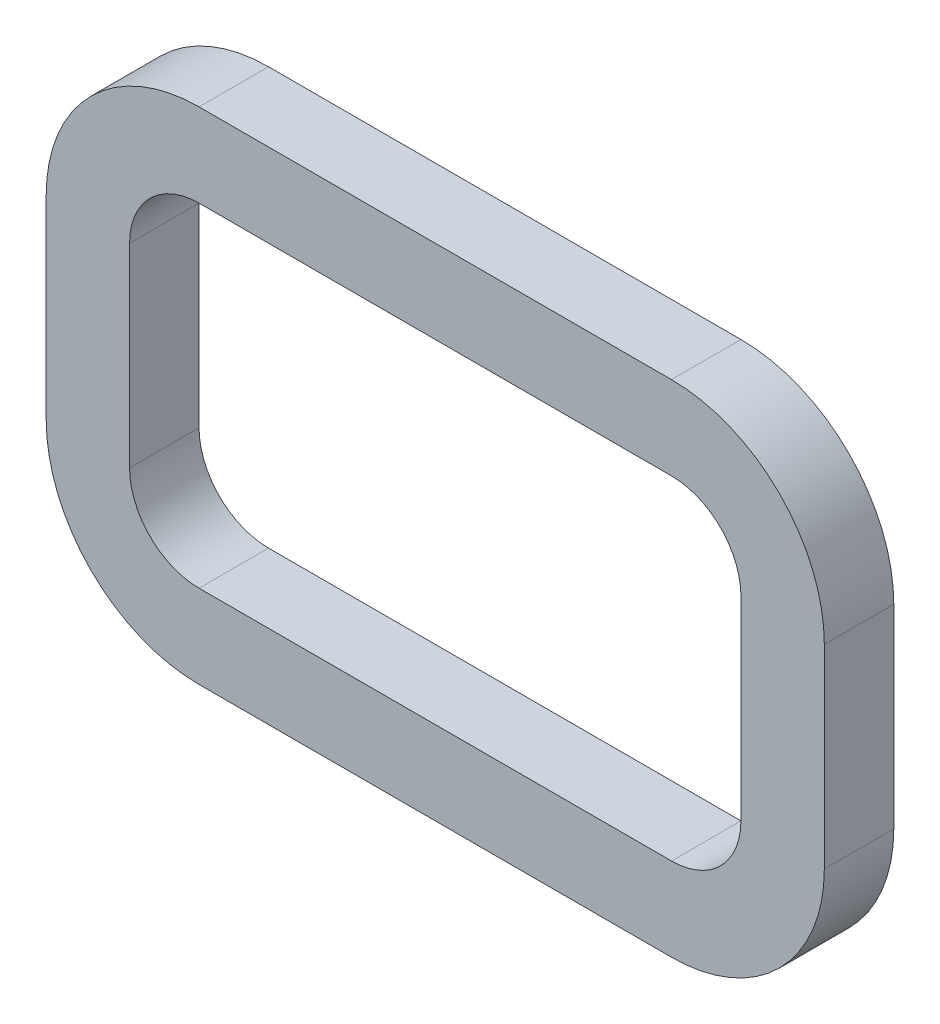
ISO-10303-21;
HEADER;
FILE_DESCRIPTION(('STEP AP214'),'2;1');
FILE_NAME('part.step','',(''),(''),'','','');
FILE_SCHEMA(('AUTOMOTIVE_DESIGN { 1 0 10303 214 1 1 1 1 }'));
ENDSEC;
DATA;
#1=APPLICATION_CONTEXT('core data for automotive mechanical design processes');
#2=APPLICATION_PROTOCOL_DEFINITION('international standard','automotive_design',2000,#1);
#3=PRODUCT_CONTEXT('',#1,'mechanical');
#4=PRODUCT('Part','Part','',(#3));
#5=PRODUCT_RELATED_PRODUCT_CATEGORY('part','',(#4));
#6=PRODUCT_DEFINITION_FORMATION('','',#4);
#7=PRODUCT_DEFINITION_CONTEXT('part definition',#1,'design');
#8=PRODUCT_DEFINITION('design','',#6,#7);
#9=PRODUCT_DEFINITION_SHAPE('','',#8);
#10=(LENGTH_UNIT() NAMED_UNIT(*) SI_UNIT(.MILLI.,.METRE.));
#11=(NAMED_UNIT(*) PLANE_ANGLE_UNIT() SI_UNIT($,.RADIAN.));
#12=(NAMED_UNIT(*) SI_UNIT($,.STERADIAN.) SOLID_ANGLE_UNIT());
#13=UNCERTAINTY_MEASURE_WITH_UNIT(LENGTH_MEASURE(1.E-05),#10,'distance_accuracy_value','');
#14=(GEOMETRIC_REPRESENTATION_CONTEXT(3) GLOBAL_UNCERTAINTY_ASSIGNED_CONTEXT((#13)) GLOBAL_UNIT_ASSIGNED_CONTEXT((#10,
#11,#12)) REPRESENTATION_CONTEXT('',''));
#15=CARTESIAN_POINT('',(0.,0.,0.));
#16=DIRECTION('',(0.,0.,1.));
#17=DIRECTION('',(1.,0.,0.));
#18=AXIS2_PLACEMENT_3D('',#15,#16,#17);
#19=CARTESIAN_POINT('',(170.,70.,50.));
#20=DIRECTION('',(0.,0.,-1.));
#21=DIRECTION('',(-1.,0.,0.));
#22=AXIS2_PLACEMENT_3D('',#19,#20,#21);
#23=PLANE('',#22);
#24=CARTESIAN_POINT('',(170.,70.,50.));
#25=DIRECTION('',(0.,0.,-1.));
#26=DIRECTION('',(-1.,0.,0.));
#27=AXIS2_PLACEMENT_3D('',#24,#25,#26);
#28=CIRCLE('',#27,110.);
#29=CARTESIAN_POINT('',(280.,69.9999999999994,50.));
#30=VERTEX_POINT('',#29);
#31=CARTESIAN_POINT('',(169.999999999999,180.,50.));
#32=VERTEX_POINT('',#31);
#33=EDGE_CURVE('E293',#30,#32,#28,.F.);
#34=ORIENTED_EDGE('',*,*,#33,.T.);
#35=DIRECTION('',(-1.,0.,0.));
#36=VECTOR('',#35,1.);
#37=CARTESIAN_POINT('',(170.,180.,50.));
#38=LINE('',#37,#36);
#39=CARTESIAN_POINT('',(-169.999999999999,180.,50.));
#40=VERTEX_POINT('',#39);
#41=EDGE_CURVE('E297',#32,#40,#38,.T.);
#42=ORIENTED_EDGE('',*,*,#41,.T.);
#43=CARTESIAN_POINT('',(-170.,70.,50.));
#44=DIRECTION('',(0.,0.,-1.));
#45=DIRECTION('',(-1.,0.,0.));
#46=AXIS2_PLACEMENT_3D('',#43,#44,#45);
#47=CIRCLE('',#46,110.);
#48=CARTESIAN_POINT('',(-280.,69.9999999999992,50.));
#49=VERTEX_POINT('',#48);
#50=EDGE_CURVE('E301',#40,#49,#47,.F.);
#51=ORIENTED_EDGE('',*,*,#50,.T.);
#52=DIRECTION('',(0.,-1.,0.));
#53=VECTOR('',#52,1.);
#54=CARTESIAN_POINT('',(-280.,69.9999999999999,50.));
#55=LINE('',#54,#53);
#56=CARTESIAN_POINT('',(-280.,-69.9999999999994,50.));
#57=VERTEX_POINT('',#56);
#58=EDGE_CURVE('E304',#49,#57,#55,.T.);
#59=ORIENTED_EDGE('',*,*,#58,.T.);
#60=CARTESIAN_POINT('',(-170.,-70.,50.));
#61=DIRECTION('',(0.,0.,-1.));
#62=DIRECTION('',(-1.,0.,0.));
#63=AXIS2_PLACEMENT_3D('',#60,#61,#62);
#64=CIRCLE('',#63,110.);
#65=CARTESIAN_POINT('',(-169.999999999999,-180.,50.));
#66=VERTEX_POINT('',#65);
#67=EDGE_CURVE('E307',#57,#66,#64,.F.);
#68=ORIENTED_EDGE('',*,*,#67,.T.);
#69=DIRECTION('',(1.,0.,0.));
#70=VECTOR('',#69,1.);
#71=CARTESIAN_POINT('',(170.,-180.,50.));
#72=LINE('',#71,#70);
#73=CARTESIAN_POINT('',(169.999999999999,-180.,50.));
#74=VERTEX_POINT('',#73);
#75=EDGE_CURVE('E310',#66,#74,#72,.T.);
#76=ORIENTED_EDGE('',*,*,#75,.T.);
#77=CARTESIAN_POINT('',(170.,-70.,50.));
#78=DIRECTION('',(0.,0.,-1.));
#79=DIRECTION('',(-1.,0.,0.));
#80=AXIS2_PLACEMENT_3D('',#77,#78,#79);
#81=CIRCLE('',#80,110.);
#82=CARTESIAN_POINT('',(280.,-70.,50.));
#83=VERTEX_POINT('',#82);
#84=EDGE_CURVE('E313',#74,#83,#81,.F.);
#85=ORIENTED_EDGE('',*,*,#84,.T.);
#86=DIRECTION('',(0.,1.,0.));
#87=VECTOR('',#86,1.);
#88=CARTESIAN_POINT('',(280.,70.,50.));
#89=LINE('',#88,#87);
#90=EDGE_CURVE('E316',#83,#30,#89,.T.);
#91=ORIENTED_EDGE('',*,*,#90,.T.);
#92=EDGE_LOOP('',(#34,#42,#51,#59,#68,#76,#85,#91));
#93=FACE_BOUND('',#92,.T.);
#94=CARTESIAN_POINT('',(170.,70.,50.));
#95=DIRECTION('',(0.,0.,-1.));
#96=DIRECTION('',(-1.,0.,0.));
#97=AXIS2_PLACEMENT_3D('',#94,#95,#96);
#98=CIRCLE('',#97,50.);
#99=CARTESIAN_POINT('',(220.,69.9999999999994,50.));
#100=VERTEX_POINT('',#99);
#101=CARTESIAN_POINT('',(169.999999999999,120.,50.));
#102=VERTEX_POINT('',#101);
#103=EDGE_CURVE('E204',#100,#102,#98,.F.);
#104=ORIENTED_EDGE('',*,*,#103,.F.);
#105=DIRECTION('',(0.,1.,0.));
#106=VECTOR('',#105,1.);
#107=CARTESIAN_POINT('',(220.,70.,50.));
#108=LINE('',#107,#106);
#109=CARTESIAN_POINT('',(220.,-70.,50.));
#110=VERTEX_POINT('',#109);
#111=EDGE_CURVE('E245',#110,#100,#108,.T.);
#112=ORIENTED_EDGE('',*,*,#111,.F.);
#113=CARTESIAN_POINT('',(170.,-70.,50.));
#114=DIRECTION('',(0.,0.,-1.));
#115=DIRECTION('',(-1.,0.,0.));
#116=AXIS2_PLACEMENT_3D('',#113,#114,#115);
#117=CIRCLE('',#116,50.);
#118=CARTESIAN_POINT('',(169.999999999999,-120.,50.));
#119=VERTEX_POINT('',#118);
#120=EDGE_CURVE('E242',#119,#110,#117,.F.);
#121=ORIENTED_EDGE('',*,*,#120,.F.);
#122=DIRECTION('',(1.,0.,0.));
#123=VECTOR('',#122,1.);
#124=CARTESIAN_POINT('',(170.,-120.,50.));
#125=LINE('',#124,#123);
#126=CARTESIAN_POINT('',(-170.,-120.,50.));
#127=VERTEX_POINT('',#126);
#128=EDGE_CURVE('E239',#127,#119,#125,.T.);
#129=ORIENTED_EDGE('',*,*,#128,.F.);
#130=CARTESIAN_POINT('',(-170.,-70.,50.));
#131=DIRECTION('',(0.,0.,-1.));
#132=DIRECTION('',(-1.,0.,0.));
#133=AXIS2_PLACEMENT_3D('',#130,#131,#132);
#134=CIRCLE('',#133,50.);
#135=CARTESIAN_POINT('',(-220.,-69.9999999999994,50.));
#136=VERTEX_POINT('',#135);
#137=EDGE_CURVE('E236',#136,#127,#134,.F.);
#138=ORIENTED_EDGE('',*,*,#137,.F.);
#139=DIRECTION('',(0.,-1.,0.));
#140=VECTOR('',#139,1.);
#141=CARTESIAN_POINT('',(-220.,69.9999999999999,50.));
#142=LINE('',#141,#140);
#143=CARTESIAN_POINT('',(-220.,69.9999999999996,50.));
#144=VERTEX_POINT('',#143);
#145=EDGE_CURVE('E231',#144,#136,#142,.T.);
#146=ORIENTED_EDGE('',*,*,#145,.F.);
#147=CARTESIAN_POINT('',(-170.,70.,50.));
#148=DIRECTION('',(0.,0.,-1.));
#149=DIRECTION('',(-1.,0.,0.));
#150=AXIS2_PLACEMENT_3D('',#147,#148,#149);
#151=CIRCLE('',#150,50.);
#152=CARTESIAN_POINT('',(-169.999999999999,120.,50.));
#153=VERTEX_POINT('',#152);
#154=EDGE_CURVE('E227',#153,#144,#151,.F.);
#155=ORIENTED_EDGE('',*,*,#154,.F.);
#156=DIRECTION('',(-1.,0.,0.));
#157=VECTOR('',#156,1.);
#158=CARTESIAN_POINT('',(170.,120.,50.));
#159=LINE('',#158,#157);
#160=EDGE_CURVE('E213',#102,#153,#159,.T.);
#161=ORIENTED_EDGE('',*,*,#160,.F.);
#162=EDGE_LOOP('',(#104,#112,#121,#129,#138,#146,#155,#161));
#163=FACE_BOUND('',#162,.T.);
#164=ADVANCED_FACE('F90',(#93,#163),#23,.F.);
#165=CARTESIAN_POINT('',(170.,70.,0.));
#166=DIRECTION('',(0.,0.,-1.));
#167=DIRECTION('',(-1.,0.,0.));
#168=AXIS2_PLACEMENT_3D('',#165,#166,#167);
#169=PLANE('',#168);
#170=CARTESIAN_POINT('',(170.,70.,0.));
#171=DIRECTION('',(0.,0.,-1.));
#172=DIRECTION('',(-1.,0.,0.));
#173=AXIS2_PLACEMENT_3D('',#170,#171,#172);
#174=CIRCLE('',#173,110.);
#175=CARTESIAN_POINT('',(280.,69.9999999999994,0.));
#176=VERTEX_POINT('',#175);
#177=CARTESIAN_POINT('',(169.999999999999,180.,0.));
#178=VERTEX_POINT('',#177);
#179=EDGE_CURVE('E222',#176,#178,#174,.F.);
#180=ORIENTED_EDGE('',*,*,#179,.F.);
#181=DIRECTION('',(0.,1.,0.));
#182=VECTOR('',#181,1.);
#183=CARTESIAN_POINT('',(280.,70.,0.));
#184=LINE('',#183,#182);
#185=CARTESIAN_POINT('',(280.,-70.,0.));
#186=VERTEX_POINT('',#185);
#187=EDGE_CURVE('E298',#186,#176,#184,.T.);
#188=ORIENTED_EDGE('',*,*,#187,.F.);
#189=CARTESIAN_POINT('',(170.,-70.,0.));
#190=DIRECTION('',(0.,0.,-1.));
#191=DIRECTION('',(-1.,0.,0.));
#192=AXIS2_PLACEMENT_3D('',#189,#190,#191);
#193=CIRCLE('',#192,110.);
#194=CARTESIAN_POINT('',(169.999999999999,-180.,0.));
#195=VERTEX_POINT('',#194);
#196=EDGE_CURVE('E338',#195,#186,#193,.F.);
#197=ORIENTED_EDGE('',*,*,#196,.F.);
#198=DIRECTION('',(1.,0.,0.));
#199=VECTOR('',#198,1.);
#200=CARTESIAN_POINT('',(170.,-180.,0.));
#201=LINE('',#200,#199);
#202=CARTESIAN_POINT('',(-169.999999999999,-180.,0.));
#203=VERTEX_POINT('',#202);
#204=EDGE_CURVE('E335',#203,#195,#201,.T.);
#205=ORIENTED_EDGE('',*,*,#204,.F.);
#206=CARTESIAN_POINT('',(-170.,-70.,0.));
#207=DIRECTION('',(0.,0.,-1.));
#208=DIRECTION('',(-1.,0.,0.));
#209=AXIS2_PLACEMENT_3D('',#206,#207,#208);
#210=CIRCLE('',#209,110.);
#211=CARTESIAN_POINT('',(-280.,-69.9999999999994,0.));
#212=VERTEX_POINT('',#211);
#213=EDGE_CURVE('E332',#212,#203,#210,.F.);
#214=ORIENTED_EDGE('',*,*,#213,.F.);
#215=DIRECTION('',(0.,-1.,0.));
#216=VECTOR('',#215,1.);
#217=CARTESIAN_POINT('',(-280.,69.9999999999999,0.));
#218=LINE('',#217,#216);
#219=CARTESIAN_POINT('',(-280.,69.9999999999992,0.));
#220=VERTEX_POINT('',#219);
#221=EDGE_CURVE('E329',#220,#212,#218,.T.);
#222=ORIENTED_EDGE('',*,*,#221,.F.);
#223=CARTESIAN_POINT('',(-170.,70.,0.));
#224=DIRECTION('',(0.,0.,-1.));
#225=DIRECTION('',(-1.,0.,0.));
#226=AXIS2_PLACEMENT_3D('',#223,#224,#225);
#227=CIRCLE('',#226,110.);
#228=CARTESIAN_POINT('',(-169.999999999999,180.,0.));
#229=VERTEX_POINT('',#228);
#230=EDGE_CURVE('E326',#229,#220,#227,.F.);
#231=ORIENTED_EDGE('',*,*,#230,.F.);
#232=DIRECTION('',(-1.,0.,0.));
#233=VECTOR('',#232,1.);
#234=CARTESIAN_POINT('',(170.,180.,0.));
#235=LINE('',#234,#233);
#236=EDGE_CURVE('E323',#178,#229,#235,.T.);
#237=ORIENTED_EDGE('',*,*,#236,.F.);
#238=EDGE_LOOP('',(#180,#188,#197,#205,#214,#222,#231,#237));
#239=FACE_BOUND('',#238,.T.);
#240=DIRECTION('',(0.,1.,0.));
#241=VECTOR('',#240,1.);
#242=CARTESIAN_POINT('',(220.,70.,0.));
#243=LINE('',#242,#241);
#244=CARTESIAN_POINT('',(220.,-70.,0.));
#245=VERTEX_POINT('',#244);
#246=CARTESIAN_POINT('',(220.,69.9999999999994,0.));
#247=VERTEX_POINT('',#246);
#248=EDGE_CURVE('E214',#245,#247,#243,.T.);
#249=ORIENTED_EDGE('',*,*,#248,.T.);
#250=CARTESIAN_POINT('',(170.,70.,0.));
#251=DIRECTION('',(0.,0.,-1.));
#252=DIRECTION('',(-1.,0.,0.));
#253=AXIS2_PLACEMENT_3D('',#250,#251,#252);
#254=CIRCLE('',#253,50.);
#255=CARTESIAN_POINT('',(169.999999999999,120.,0.));
#256=VERTEX_POINT('',#255);
#257=EDGE_CURVE('E114',#247,#256,#254,.F.);
#258=ORIENTED_EDGE('',*,*,#257,.T.);
#259=DIRECTION('',(-1.,0.,0.));
#260=VECTOR('',#259,1.);
#261=CARTESIAN_POINT('',(170.,120.,0.));
#262=LINE('',#261,#260);
#263=CARTESIAN_POINT('',(-169.999999999999,120.,0.));
#264=VERTEX_POINT('',#263);
#265=EDGE_CURVE('E220',#256,#264,#262,.T.);
#266=ORIENTED_EDGE('',*,*,#265,.T.);
#267=CARTESIAN_POINT('',(-170.,70.,0.));
#268=DIRECTION('',(0.,0.,-1.));
#269=DIRECTION('',(-1.,0.,0.));
#270=AXIS2_PLACEMENT_3D('',#267,#268,#269);
#271=CIRCLE('',#270,50.);
#272=CARTESIAN_POINT('',(-220.,69.9999999999996,0.));
#273=VERTEX_POINT('',#272);
#274=EDGE_CURVE('E252',#264,#273,#271,.F.);
#275=ORIENTED_EDGE('',*,*,#274,.T.);
#276=DIRECTION('',(0.,-1.,0.));
#277=VECTOR('',#276,1.);
#278=CARTESIAN_POINT('',(-220.,69.9999999999999,0.));
#279=LINE('',#278,#277);
#280=CARTESIAN_POINT('',(-220.,-69.9999999999994,0.));
#281=VERTEX_POINT('',#280);
#282=EDGE_CURVE('E256',#273,#281,#279,.T.);
#283=ORIENTED_EDGE('',*,*,#282,.T.);
#284=CARTESIAN_POINT('',(-170.,-70.,0.));
#285=DIRECTION('',(0.,0.,-1.));
#286=DIRECTION('',(-1.,0.,0.));
#287=AXIS2_PLACEMENT_3D('',#284,#285,#286);
#288=CIRCLE('',#287,50.);
#289=CARTESIAN_POINT('',(-170.,-120.,0.));
#290=VERTEX_POINT('',#289);
#291=EDGE_CURVE('E260',#281,#290,#288,.F.);
#292=ORIENTED_EDGE('',*,*,#291,.T.);
#293=DIRECTION('',(1.,0.,0.));
#294=VECTOR('',#293,1.);
#295=CARTESIAN_POINT('',(170.,-120.,0.));
#296=LINE('',#295,#294);
#297=CARTESIAN_POINT('',(169.999999999999,-120.,0.));
#298=VERTEX_POINT('',#297);
#299=EDGE_CURVE('E264',#290,#298,#296,.T.);
#300=ORIENTED_EDGE('',*,*,#299,.T.);
#301=CARTESIAN_POINT('',(170.,-70.,0.));
#302=DIRECTION('',(0.,0.,-1.));
#303=DIRECTION('',(-1.,0.,0.));
#304=AXIS2_PLACEMENT_3D('',#301,#302,#303);
#305=CIRCLE('',#304,50.);
#306=EDGE_CURVE('E268',#298,#245,#305,.F.);
#307=ORIENTED_EDGE('',*,*,#306,.T.);
#308=EDGE_LOOP('',(#249,#258,#266,#275,#283,#292,#300,#307));
#309=FACE_BOUND('',#308,.T.);
#310=ADVANCED_FACE('F377',(#239,#309),#169,.T.);
#311=CARTESIAN_POINT('',(170.,70.,50.));
#312=DIRECTION('',(0.,0.,-1.));
#313=DIRECTION('',(-1.,0.,0.));
#314=AXIS2_PLACEMENT_3D('',#311,#312,#313);
#315=CYLINDRICAL_SURFACE('',#314,110.);
#316=ORIENTED_EDGE('',*,*,#179,.T.);
#317=DIRECTION('',(0.,0.,-1.));
#318=VECTOR('',#317,1.);
#319=CARTESIAN_POINT('',(169.999999999999,180.,50.));
#320=LINE('',#319,#318);
#321=EDGE_CURVE('E12',#32,#178,#320,.T.);
#322=ORIENTED_EDGE('',*,*,#321,.F.);
#323=ORIENTED_EDGE('',*,*,#33,.F.);
#324=DIRECTION('',(0.,0.,-1.));
#325=VECTOR('',#324,1.);
#326=CARTESIAN_POINT('',(280.,69.9999999999994,50.));
#327=LINE('',#326,#325);
#328=EDGE_CURVE('E319',#30,#176,#327,.T.);
#329=ORIENTED_EDGE('',*,*,#328,.T.);
#330=EDGE_LOOP('',(#316,#322,#323,#329));
#331=FACE_BOUND('',#330,.T.);
#332=ADVANCED_FACE('F92',(#331),#315,.T.);
#333=CARTESIAN_POINT('',(170.,180.,50.));
#334=DIRECTION('',(0.,-1.,0.));
#335=DIRECTION('',(0.,0.,-1.));
#336=AXIS2_PLACEMENT_3D('',#333,#334,#335);
#337=PLANE('',#336);
#338=ORIENTED_EDGE('',*,*,#236,.T.);
#339=DIRECTION('',(0.,0.,-1.));
#340=VECTOR('',#339,1.);
#341=CARTESIAN_POINT('',(-169.999999999999,180.,50.));
#342=LINE('',#341,#340);
#343=EDGE_CURVE('E99',#40,#229,#342,.T.);
#344=ORIENTED_EDGE('',*,*,#343,.F.);
#345=ORIENTED_EDGE('',*,*,#41,.F.);
#346=ORIENTED_EDGE('',*,*,#321,.T.);
#347=EDGE_LOOP('',(#338,#344,#345,#346));
#348=FACE_BOUND('',#347,.T.);
#349=ADVANCED_FACE('F394',(#348),#337,.F.);
#350=CARTESIAN_POINT('',(-170.,70.,50.));
#351=DIRECTION('',(0.,0.,-1.));
#352=DIRECTION('',(-1.,0.,0.));
#353=AXIS2_PLACEMENT_3D('',#350,#351,#352);
#354=CYLINDRICAL_SURFACE('',#353,110.);
#355=ORIENTED_EDGE('',*,*,#230,.T.);
#356=DIRECTION('',(0.,0.,-1.));
#357=VECTOR('',#356,1.);
#358=CARTESIAN_POINT('',(-280.,69.9999999999992,50.));
#359=LINE('',#358,#357);
#360=EDGE_CURVE('E362',#49,#220,#359,.T.);
#361=ORIENTED_EDGE('',*,*,#360,.F.);
#362=ORIENTED_EDGE('',*,*,#50,.F.);
#363=ORIENTED_EDGE('',*,*,#343,.T.);
#364=EDGE_LOOP('',(#355,#361,#362,#363));
#365=FACE_BOUND('',#364,.T.);
#366=ADVANCED_FACE('F371',(#365),#354,.T.);
#367=CARTESIAN_POINT('',(-280.,69.9999999999999,50.));
#368=DIRECTION('',(1.,0.,0.));
#369=DIRECTION('',(0.,1.,0.));
#370=AXIS2_PLACEMENT_3D('',#367,#368,#369);
#371=PLANE('',#370);
#372=ORIENTED_EDGE('',*,*,#221,.T.);
#373=DIRECTION('',(0.,0.,-1.));
#374=VECTOR('',#373,1.);
#375=CARTESIAN_POINT('',(-280.,-69.9999999999994,50.));
#376=LINE('',#375,#374);
#377=EDGE_CURVE('E358',#57,#212,#376,.T.);
#378=ORIENTED_EDGE('',*,*,#377,.F.);
#379=ORIENTED_EDGE('',*,*,#58,.F.);
#380=ORIENTED_EDGE('',*,*,#360,.T.);
#381=EDGE_LOOP('',(#372,#378,#379,#380));
#382=FACE_BOUND('',#381,.T.);
#383=ADVANCED_FACE('F383',(#382),#371,.F.);
#384=CARTESIAN_POINT('',(-170.,-70.,50.));
#385=DIRECTION('',(0.,0.,-1.));
#386=DIRECTION('',(-1.,0.,0.));
#387=AXIS2_PLACEMENT_3D('',#384,#385,#386);
#388=CYLINDRICAL_SURFACE('',#387,110.);
#389=ORIENTED_EDGE('',*,*,#213,.T.);
#390=DIRECTION('',(0.,0.,-1.));
#391=VECTOR('',#390,1.);
#392=CARTESIAN_POINT('',(-169.999999999999,-180.,50.));
#393=LINE('',#392,#391);
#394=EDGE_CURVE('E354',#66,#203,#393,.T.);
#395=ORIENTED_EDGE('',*,*,#394,.F.);
#396=ORIENTED_EDGE('',*,*,#67,.F.);
#397=ORIENTED_EDGE('',*,*,#377,.T.);
#398=EDGE_LOOP('',(#389,#395,#396,#397));
#399=FACE_BOUND('',#398,.T.);
#400=ADVANCED_FACE('F387',(#399),#388,.T.);
#401=CARTESIAN_POINT('',(170.,-180.,50.));
#402=DIRECTION('',(0.,1.,0.));
#403=DIRECTION('',(0.,0.,1.));
#404=AXIS2_PLACEMENT_3D('',#401,#402,#403);
#405=PLANE('',#404);
#406=ORIENTED_EDGE('',*,*,#204,.T.);
#407=DIRECTION('',(0.,0.,-1.));
#408=VECTOR('',#407,1.);
#409=CARTESIAN_POINT('',(169.999999999999,-180.,50.));
#410=LINE('',#409,#408);
#411=EDGE_CURVE('E350',#74,#195,#410,.T.);
#412=ORIENTED_EDGE('',*,*,#411,.F.);
#413=ORIENTED_EDGE('',*,*,#75,.F.);
#414=ORIENTED_EDGE('',*,*,#394,.T.);
#415=EDGE_LOOP('',(#406,#412,#413,#414));
#416=FACE_BOUND('',#415,.T.);
#417=ADVANCED_FACE('F407',(#416),#405,.F.);
#418=CARTESIAN_POINT('',(170.,-70.,50.));
#419=DIRECTION('',(0.,0.,-1.));
#420=DIRECTION('',(-1.,0.,0.));
#421=AXIS2_PLACEMENT_3D('',#418,#419,#420);
#422=CYLINDRICAL_SURFACE('',#421,110.);
#423=ORIENTED_EDGE('',*,*,#196,.T.);
#424=DIRECTION('',(0.,0.,-1.));
#425=VECTOR('',#424,1.);
#426=CARTESIAN_POINT('',(280.,-70.,50.));
#427=LINE('',#426,#425);
#428=EDGE_CURVE('E346',#83,#186,#427,.T.);
#429=ORIENTED_EDGE('',*,*,#428,.F.);
#430=ORIENTED_EDGE('',*,*,#84,.F.);
#431=ORIENTED_EDGE('',*,*,#411,.T.);
#432=EDGE_LOOP('',(#423,#429,#430,#431));
#433=FACE_BOUND('',#432,.T.);
#434=ADVANCED_FACE('F405',(#433),#422,.T.);
#435=CARTESIAN_POINT('',(280.,70.,50.));
#436=DIRECTION('',(-1.,0.,0.));
#437=DIRECTION('',(0.,-1.,0.));
#438=AXIS2_PLACEMENT_3D('',#435,#436,#437);
#439=PLANE('',#438);
#440=ORIENTED_EDGE('',*,*,#187,.T.);
#441=ORIENTED_EDGE('',*,*,#328,.F.);
#442=ORIENTED_EDGE('',*,*,#90,.F.);
#443=ORIENTED_EDGE('',*,*,#428,.T.);
#444=EDGE_LOOP('',(#440,#441,#442,#443));
#445=FACE_BOUND('',#444,.T.);
#446=ADVANCED_FACE('F400',(#445),#439,.F.);
#447=CARTESIAN_POINT('',(170.,70.,50.));
#448=DIRECTION('',(0.,0.,-1.));
#449=DIRECTION('',(-1.,0.,0.));
#450=AXIS2_PLACEMENT_3D('',#447,#448,#449);
#451=CYLINDRICAL_SURFACE('',#450,50.);
#452=ORIENTED_EDGE('',*,*,#257,.F.);
#453=DIRECTION('',(0.,0.,-1.));
#454=VECTOR('',#453,1.);
#455=CARTESIAN_POINT('',(220.,69.9999999999994,50.));
#456=LINE('',#455,#454);
#457=EDGE_CURVE('E208',#100,#247,#456,.T.);
#458=ORIENTED_EDGE('',*,*,#457,.F.);
#459=ORIENTED_EDGE('',*,*,#103,.T.);
#460=DIRECTION('',(0.,0.,-1.));
#461=VECTOR('',#460,1.);
#462=CARTESIAN_POINT('',(169.999999999999,120.,50.));
#463=LINE('',#462,#461);
#464=EDGE_CURVE('E207',#102,#256,#463,.T.);
#465=ORIENTED_EDGE('',*,*,#464,.T.);
#466=EDGE_LOOP('',(#452,#458,#459,#465));
#467=FACE_BOUND('',#466,.T.);
#468=ADVANCED_FACE('F206',(#467),#451,.F.);
#469=CARTESIAN_POINT('',(170.,120.,50.));
#470=DIRECTION('',(0.,-1.,0.));
#471=DIRECTION('',(0.,0.,-1.));
#472=AXIS2_PLACEMENT_3D('',#469,#470,#471);
#473=PLANE('',#472);
#474=ORIENTED_EDGE('',*,*,#265,.F.);
#475=ORIENTED_EDGE('',*,*,#464,.F.);
#476=ORIENTED_EDGE('',*,*,#160,.T.);
#477=DIRECTION('',(0.,0.,-1.));
#478=VECTOR('',#477,1.);
#479=CARTESIAN_POINT('',(-169.999999999999,120.,50.));
#480=LINE('',#479,#478);
#481=EDGE_CURVE('E223',#153,#264,#480,.T.);
#482=ORIENTED_EDGE('',*,*,#481,.T.);
#483=EDGE_LOOP('',(#474,#475,#476,#482));
#484=FACE_BOUND('',#483,.T.);
#485=ADVANCED_FACE('F217',(#484),#473,.T.);
#486=CARTESIAN_POINT('',(-170.,70.,50.));
#487=DIRECTION('',(0.,0.,-1.));
#488=DIRECTION('',(-1.,0.,0.));
#489=AXIS2_PLACEMENT_3D('',#486,#487,#488);
#490=CYLINDRICAL_SURFACE('',#489,50.);
#491=ORIENTED_EDGE('',*,*,#274,.F.);
#492=ORIENTED_EDGE('',*,*,#481,.F.);
#493=ORIENTED_EDGE('',*,*,#154,.T.);
#494=DIRECTION('',(0.,0.,-1.));
#495=VECTOR('',#494,1.);
#496=CARTESIAN_POINT('',(-220.,69.9999999999996,50.));
#497=LINE('',#496,#495);
#498=EDGE_CURVE('E288',#144,#273,#497,.T.);
#499=ORIENTED_EDGE('',*,*,#498,.T.);
#500=EDGE_LOOP('',(#491,#492,#493,#499));
#501=FACE_BOUND('',#500,.T.);
#502=ADVANCED_FACE('F432',(#501),#490,.F.);
#503=CARTESIAN_POINT('',(-220.,69.9999999999999,50.));
#504=DIRECTION('',(1.,0.,0.));
#505=DIRECTION('',(0.,1.,0.));
#506=AXIS2_PLACEMENT_3D('',#503,#504,#505);
#507=PLANE('',#506);
#508=ORIENTED_EDGE('',*,*,#282,.F.);
#509=ORIENTED_EDGE('',*,*,#498,.F.);
#510=ORIENTED_EDGE('',*,*,#145,.T.);
#511=DIRECTION('',(0.,0.,-1.));
#512=VECTOR('',#511,1.);
#513=CARTESIAN_POINT('',(-220.,-69.9999999999994,50.));
#514=LINE('',#513,#512);
#515=EDGE_CURVE('E285',#136,#281,#514,.T.);
#516=ORIENTED_EDGE('',*,*,#515,.T.);
#517=EDGE_LOOP('',(#508,#509,#510,#516));
#518=FACE_BOUND('',#517,.T.);
#519=ADVANCED_FACE('F436',(#518),#507,.T.);
#520=CARTESIAN_POINT('',(-170.,-70.,50.));
#521=DIRECTION('',(0.,0.,-1.));
#522=DIRECTION('',(-1.,0.,0.));
#523=AXIS2_PLACEMENT_3D('',#520,#521,#522);
#524=CYLINDRICAL_SURFACE('',#523,50.);
#525=ORIENTED_EDGE('',*,*,#291,.F.);
#526=ORIENTED_EDGE('',*,*,#515,.F.);
#527=ORIENTED_EDGE('',*,*,#137,.T.);
#528=DIRECTION('',(0.,0.,-1.));
#529=VECTOR('',#528,1.);
#530=CARTESIAN_POINT('',(-170.,-120.,50.));
#531=LINE('',#530,#529);
#532=EDGE_CURVE('E282',#127,#290,#531,.T.);
#533=ORIENTED_EDGE('',*,*,#532,.T.);
#534=EDGE_LOOP('',(#525,#526,#527,#533));
#535=FACE_BOUND('',#534,.T.);
#536=ADVANCED_FACE('F442',(#535),#524,.F.);
#537=CARTESIAN_POINT('',(170.,-120.,50.));
#538=DIRECTION('',(0.,1.,0.));
#539=DIRECTION('',(0.,0.,1.));
#540=AXIS2_PLACEMENT_3D('',#537,#538,#539);
#541=PLANE('',#540);
#542=ORIENTED_EDGE('',*,*,#299,.F.);
#543=ORIENTED_EDGE('',*,*,#532,.F.);
#544=ORIENTED_EDGE('',*,*,#128,.T.);
#545=DIRECTION('',(0.,0.,-1.));
#546=VECTOR('',#545,1.);
#547=CARTESIAN_POINT('',(169.999999999999,-120.,50.));
#548=LINE('',#547,#546);
#549=EDGE_CURVE('E279',#119,#298,#548,.T.);
#550=ORIENTED_EDGE('',*,*,#549,.T.);
#551=EDGE_LOOP('',(#542,#543,#544,#550));
#552=FACE_BOUND('',#551,.T.);
#553=ADVANCED_FACE('F446',(#552),#541,.T.);
#554=CARTESIAN_POINT('',(170.,-70.,50.));
#555=DIRECTION('',(0.,0.,-1.));
#556=DIRECTION('',(-1.,0.,0.));
#557=AXIS2_PLACEMENT_3D('',#554,#555,#556);
#558=CYLINDRICAL_SURFACE('',#557,50.);
#559=ORIENTED_EDGE('',*,*,#306,.F.);
#560=ORIENTED_EDGE('',*,*,#549,.F.);
#561=ORIENTED_EDGE('',*,*,#120,.T.);
#562=DIRECTION('',(0.,0.,-1.));
#563=VECTOR('',#562,1.);
#564=CARTESIAN_POINT('',(220.,-70.,50.));
#565=LINE('',#564,#563);
#566=EDGE_CURVE('E106',#110,#245,#565,.T.);
#567=ORIENTED_EDGE('',*,*,#566,.T.);
#568=EDGE_LOOP('',(#559,#560,#561,#567));
#569=FACE_BOUND('',#568,.T.);
#570=ADVANCED_FACE('F450',(#569),#558,.F.);
#571=CARTESIAN_POINT('',(220.,70.,50.));
#572=DIRECTION('',(-1.,0.,0.));
#573=DIRECTION('',(0.,-1.,0.));
#574=AXIS2_PLACEMENT_3D('',#571,#572,#573);
#575=PLANE('',#574);
#576=ORIENTED_EDGE('',*,*,#248,.F.);
#577=ORIENTED_EDGE('',*,*,#566,.F.);
#578=ORIENTED_EDGE('',*,*,#111,.T.);
#579=ORIENTED_EDGE('',*,*,#457,.T.);
#580=EDGE_LOOP('',(#576,#577,#578,#579));
#581=FACE_BOUND('',#580,.T.);
#582=ADVANCED_FACE('F454',(#581),#575,.T.);
#583=CLOSED_SHELL('',(#164,#310,#332,#349,#366,#383,#400,#417,#434,#446,#468,#485,#502,#519,
#536,#553,#570,#582));
#584=MANIFOLD_SOLID_BREP('B2',#583);
#585=ADVANCED_BREP_SHAPE_REPRESENTATION('',(#18,#584),#14);
#586=SHAPE_DEFINITION_REPRESENTATION(#9,#585);
ENDSEC;
END-ISO-10303-21;
